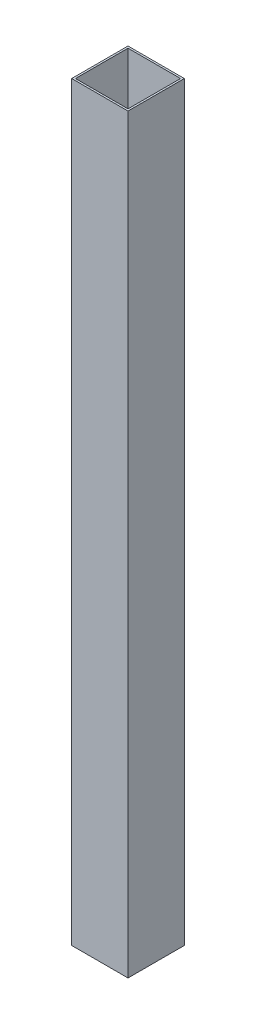
ISO-10303-21;
HEADER;
FILE_DESCRIPTION(('STEP AP214'),'2;1');
FILE_NAME('part.step','',(''),(''),'','','');
FILE_SCHEMA(('AUTOMOTIVE_DESIGN { 1 0 10303 214 1 1 1 1 }'));
ENDSEC;
DATA;
#1=APPLICATION_CONTEXT('core data for automotive mechanical design processes');
#2=APPLICATION_PROTOCOL_DEFINITION('international standard','automotive_design',2000,#1);
#3=PRODUCT_CONTEXT('',#1,'mechanical');
#4=PRODUCT('Part','Part','',(#3));
#5=PRODUCT_RELATED_PRODUCT_CATEGORY('part','',(#4));
#6=PRODUCT_DEFINITION_FORMATION('','',#4);
#7=PRODUCT_DEFINITION_CONTEXT('part definition',#1,'design');
#8=PRODUCT_DEFINITION('design','',#6,#7);
#9=PRODUCT_DEFINITION_SHAPE('','',#8);
#10=(LENGTH_UNIT() NAMED_UNIT(*) SI_UNIT(.MILLI.,.METRE.));
#11=(NAMED_UNIT(*) PLANE_ANGLE_UNIT() SI_UNIT($,.RADIAN.));
#12=(NAMED_UNIT(*) SI_UNIT($,.STERADIAN.) SOLID_ANGLE_UNIT());
#13=UNCERTAINTY_MEASURE_WITH_UNIT(LENGTH_MEASURE(1.E-05),#10,'distance_accuracy_value','');
#14=(GEOMETRIC_REPRESENTATION_CONTEXT(3) GLOBAL_UNCERTAINTY_ASSIGNED_CONTEXT((#13)) GLOBAL_UNIT_ASSIGNED_CONTEXT((#10,
#11,#12)) REPRESENTATION_CONTEXT('',''));
#15=CARTESIAN_POINT('',(0.,0.,0.));
#16=DIRECTION('',(0.,0.,1.));
#17=DIRECTION('',(1.,0.,0.));
#18=AXIS2_PLACEMENT_3D('',#15,#16,#17);
#19=CARTESIAN_POINT('',(38.1,0.,0.));
#20=DIRECTION('',(1.,0.,0.));
#21=DIRECTION('',(0.,0.,-1.));
#22=AXIS2_PLACEMENT_3D('',#19,#20,#21);
#23=PLANE('',#22);
#24=DIRECTION('',(0.,1.,0.));
#25=VECTOR('',#24,1.);
#26=CARTESIAN_POINT('',(38.1,0.,0.));
#27=LINE('',#26,#25);
#28=CARTESIAN_POINT('',(38.1,0.,0.));
#29=VERTEX_POINT('',#28);
#30=CARTESIAN_POINT('',(38.1,508.,0.));
#31=VERTEX_POINT('',#30);
#32=EDGE_CURVE('E114',#29,#31,#27,.T.);
#33=ORIENTED_EDGE('',*,*,#32,.F.);
#34=DIRECTION('',(0.,0.,1.));
#35=VECTOR('',#34,1.);
#36=CARTESIAN_POINT('',(38.1,0.,0.));
#37=LINE('',#36,#35);
#38=CARTESIAN_POINT('',(38.1,0.,-38.1));
#39=VERTEX_POINT('',#38);
#40=EDGE_CURVE('E136',#29,#39,#37,.F.);
#41=ORIENTED_EDGE('',*,*,#40,.T.);
#42=DIRECTION('',(0.,1.,0.));
#43=VECTOR('',#42,1.);
#44=CARTESIAN_POINT('',(38.1,0.,-38.1));
#45=LINE('',#44,#43);
#46=CARTESIAN_POINT('',(38.1,508.,-38.1));
#47=VERTEX_POINT('',#46);
#48=EDGE_CURVE('E131',#47,#39,#45,.F.);
#49=ORIENTED_EDGE('',*,*,#48,.F.);
#50=DIRECTION('',(0.,0.,1.));
#51=VECTOR('',#50,1.);
#52=CARTESIAN_POINT('',(38.1,508.,0.));
#53=LINE('',#52,#51);
#54=EDGE_CURVE('E106',#31,#47,#53,.F.);
#55=ORIENTED_EDGE('',*,*,#54,.F.);
#56=EDGE_LOOP('',(#33,#41,#49,#55));
#57=FACE_BOUND('',#56,.T.);
#58=ADVANCED_FACE('F17',(#57),#23,.T.);
#59=CARTESIAN_POINT('',(1.27,0.,-36.83));
#60=DIRECTION('',(0.,0.,1.));
#61=DIRECTION('',(1.,0.,0.));
#62=AXIS2_PLACEMENT_3D('',#59,#60,#61);
#63=PLANE('',#62);
#64=DIRECTION('',(0.,1.,0.));
#65=VECTOR('',#64,1.);
#66=CARTESIAN_POINT('',(1.27,0.,-36.83));
#67=LINE('',#66,#65);
#68=CARTESIAN_POINT('',(1.27,0.,-36.83));
#69=VERTEX_POINT('',#68);
#70=CARTESIAN_POINT('',(1.27,508.,-36.83));
#71=VERTEX_POINT('',#70);
#72=EDGE_CURVE('E91',#69,#71,#67,.T.);
#73=ORIENTED_EDGE('',*,*,#72,.F.);
#74=DIRECTION('',(1.,0.,0.));
#75=VECTOR('',#74,1.);
#76=CARTESIAN_POINT('',(0.,0.,-36.83));
#77=LINE('',#76,#75);
#78=CARTESIAN_POINT('',(36.83,0.,-36.83));
#79=VERTEX_POINT('',#78);
#80=EDGE_CURVE('E139',#69,#79,#77,.T.);
#81=ORIENTED_EDGE('',*,*,#80,.T.);
#82=DIRECTION('',(0.,1.,0.));
#83=VECTOR('',#82,1.);
#84=CARTESIAN_POINT('',(36.83,0.,-36.83));
#85=LINE('',#84,#83);
#86=CARTESIAN_POINT('',(36.83,508.,-36.83));
#87=VERTEX_POINT('',#86);
#88=EDGE_CURVE('E20',#87,#79,#85,.F.);
#89=ORIENTED_EDGE('',*,*,#88,.F.);
#90=DIRECTION('',(1.,0.,0.));
#91=VECTOR('',#90,1.);
#92=CARTESIAN_POINT('',(0.,508.,-36.83));
#93=LINE('',#92,#91);
#94=EDGE_CURVE('E105',#71,#87,#93,.T.);
#95=ORIENTED_EDGE('',*,*,#94,.F.);
#96=EDGE_LOOP('',(#73,#81,#89,#95));
#97=FACE_BOUND('',#96,.T.);
#98=ADVANCED_FACE('F125',(#97),#63,.T.);
#99=CARTESIAN_POINT('',(36.83,0.,-36.83));
#100=DIRECTION('',(-1.,0.,0.));
#101=DIRECTION('',(0.,0.,1.));
#102=AXIS2_PLACEMENT_3D('',#99,#100,#101);
#103=PLANE('',#102);
#104=ORIENTED_EDGE('',*,*,#88,.T.);
#105=DIRECTION('',(0.,0.,1.));
#106=VECTOR('',#105,1.);
#107=CARTESIAN_POINT('',(36.83,0.,0.));
#108=LINE('',#107,#106);
#109=CARTESIAN_POINT('',(36.83,0.,-1.27));
#110=VERTEX_POINT('',#109);
#111=EDGE_CURVE('E88',#79,#110,#108,.T.);
#112=ORIENTED_EDGE('',*,*,#111,.T.);
#113=DIRECTION('',(0.,1.,0.));
#114=VECTOR('',#113,1.);
#115=CARTESIAN_POINT('',(36.83,0.,-1.27));
#116=LINE('',#115,#114);
#117=CARTESIAN_POINT('',(36.83,508.,-1.27));
#118=VERTEX_POINT('',#117);
#119=EDGE_CURVE('E80',#118,#110,#116,.F.);
#120=ORIENTED_EDGE('',*,*,#119,.F.);
#121=DIRECTION('',(0.,0.,1.));
#122=VECTOR('',#121,1.);
#123=CARTESIAN_POINT('',(36.83,508.,0.));
#124=LINE('',#123,#122);
#125=EDGE_CURVE('E85',#87,#118,#124,.T.);
#126=ORIENTED_EDGE('',*,*,#125,.F.);
#127=EDGE_LOOP('',(#104,#112,#120,#126));
#128=FACE_BOUND('',#127,.T.);
#129=ADVANCED_FACE('F83',(#128),#103,.T.);
#130=CARTESIAN_POINT('',(36.83,0.,-1.27));
#131=DIRECTION('',(0.,0.,-1.));
#132=DIRECTION('',(-1.,0.,0.));
#133=AXIS2_PLACEMENT_3D('',#130,#131,#132);
#134=PLANE('',#133);
#135=ORIENTED_EDGE('',*,*,#119,.T.);
#136=DIRECTION('',(1.,0.,0.));
#137=VECTOR('',#136,1.);
#138=CARTESIAN_POINT('',(0.,0.,-1.27));
#139=LINE('',#138,#137);
#140=CARTESIAN_POINT('',(1.27,0.,-1.27));
#141=VERTEX_POINT('',#140);
#142=EDGE_CURVE('E142',#110,#141,#139,.F.);
#143=ORIENTED_EDGE('',*,*,#142,.T.);
#144=DIRECTION('',(0.,1.,0.));
#145=VECTOR('',#144,1.);
#146=CARTESIAN_POINT('',(1.27,0.,-1.27));
#147=LINE('',#146,#145);
#148=CARTESIAN_POINT('',(1.27,508.,-1.27));
#149=VERTEX_POINT('',#148);
#150=EDGE_CURVE('E96',#149,#141,#147,.F.);
#151=ORIENTED_EDGE('',*,*,#150,.F.);
#152=DIRECTION('',(1.,0.,0.));
#153=VECTOR('',#152,1.);
#154=CARTESIAN_POINT('',(0.,508.,-1.27));
#155=LINE('',#154,#153);
#156=EDGE_CURVE('E93',#118,#149,#155,.F.);
#157=ORIENTED_EDGE('',*,*,#156,.F.);
#158=EDGE_LOOP('',(#135,#143,#151,#157));
#159=FACE_BOUND('',#158,.T.);
#160=ADVANCED_FACE('F94',(#159),#134,.T.);
#161=CARTESIAN_POINT('',(1.27,0.,-1.27));
#162=DIRECTION('',(1.,0.,0.));
#163=DIRECTION('',(0.,0.,-1.));
#164=AXIS2_PLACEMENT_3D('',#161,#162,#163);
#165=PLANE('',#164);
#166=ORIENTED_EDGE('',*,*,#150,.T.);
#167=DIRECTION('',(0.,0.,1.));
#168=VECTOR('',#167,1.);
#169=CARTESIAN_POINT('',(1.27,0.,0.));
#170=LINE('',#169,#168);
#171=EDGE_CURVE('E122',#141,#69,#170,.F.);
#172=ORIENTED_EDGE('',*,*,#171,.T.);
#173=ORIENTED_EDGE('',*,*,#72,.T.);
#174=DIRECTION('',(0.,0.,1.));
#175=VECTOR('',#174,1.);
#176=CARTESIAN_POINT('',(1.27,508.,0.));
#177=LINE('',#176,#175);
#178=EDGE_CURVE('E100',#149,#71,#177,.F.);
#179=ORIENTED_EDGE('',*,*,#178,.F.);
#180=EDGE_LOOP('',(#166,#172,#173,#179));
#181=FACE_BOUND('',#180,.T.);
#182=ADVANCED_FACE('F120',(#181),#165,.T.);
#183=CARTESIAN_POINT('',(0.,0.,0.));
#184=DIRECTION('',(0.,0.,1.));
#185=DIRECTION('',(1.,0.,0.));
#186=AXIS2_PLACEMENT_3D('',#183,#184,#185);
#187=PLANE('',#186);
#188=DIRECTION('',(0.,1.,0.));
#189=VECTOR('',#188,1.);
#190=CARTESIAN_POINT('',(0.,0.,0.));
#191=LINE('',#190,#189);
#192=CARTESIAN_POINT('',(0.,0.,0.));
#193=VERTEX_POINT('',#192);
#194=CARTESIAN_POINT('',(0.,508.,0.));
#195=VERTEX_POINT('',#194);
#196=EDGE_CURVE('E145',#193,#195,#191,.T.);
#197=ORIENTED_EDGE('',*,*,#196,.F.);
#198=DIRECTION('',(1.,0.,0.));
#199=VECTOR('',#198,1.);
#200=CARTESIAN_POINT('',(0.,0.,0.));
#201=LINE('',#200,#199);
#202=EDGE_CURVE('E133',#193,#29,#201,.T.);
#203=ORIENTED_EDGE('',*,*,#202,.T.);
#204=ORIENTED_EDGE('',*,*,#32,.T.);
#205=DIRECTION('',(1.,0.,0.));
#206=VECTOR('',#205,1.);
#207=CARTESIAN_POINT('',(0.,508.,0.));
#208=LINE('',#207,#206);
#209=EDGE_CURVE('E108',#195,#31,#208,.T.);
#210=ORIENTED_EDGE('',*,*,#209,.F.);
#211=EDGE_LOOP('',(#197,#203,#204,#210));
#212=FACE_BOUND('',#211,.T.);
#213=ADVANCED_FACE('F164',(#212),#187,.T.);
#214=CARTESIAN_POINT('',(0.,508.,0.));
#215=DIRECTION('',(0.,1.,0.));
#216=DIRECTION('',(0.,0.,1.));
#217=AXIS2_PLACEMENT_3D('',#214,#215,#216);
#218=PLANE('',#217);
#219=ORIENTED_EDGE('',*,*,#178,.T.);
#220=ORIENTED_EDGE('',*,*,#94,.T.);
#221=ORIENTED_EDGE('',*,*,#125,.T.);
#222=ORIENTED_EDGE('',*,*,#156,.T.);
#223=EDGE_LOOP('',(#219,#220,#221,#222));
#224=FACE_BOUND('',#223,.T.);
#225=DIRECTION('',(-1.,0.,0.));
#226=VECTOR('',#225,1.);
#227=CARTESIAN_POINT('',(38.1,508.,-38.1));
#228=LINE('',#227,#226);
#229=CARTESIAN_POINT('',(0.,508.,-38.1));
#230=VERTEX_POINT('',#229);
#231=EDGE_CURVE('E126',#230,#47,#228,.F.);
#232=ORIENTED_EDGE('',*,*,#231,.F.);
#233=DIRECTION('',(0.,0.,1.));
#234=VECTOR('',#233,1.);
#235=CARTESIAN_POINT('',(0.,508.,-38.1));
#236=LINE('',#235,#234);
#237=EDGE_CURVE('E148',#195,#230,#236,.F.);
#238=ORIENTED_EDGE('',*,*,#237,.F.);
#239=ORIENTED_EDGE('',*,*,#209,.T.);
#240=ORIENTED_EDGE('',*,*,#54,.T.);
#241=EDGE_LOOP('',(#232,#238,#239,#240));
#242=FACE_BOUND('',#241,.T.);
#243=ADVANCED_FACE('F102',(#224,#242),#218,.T.);
#244=CARTESIAN_POINT('',(38.1,0.,-38.1));
#245=DIRECTION('',(0.,0.,-1.));
#246=DIRECTION('',(-1.,0.,0.));
#247=AXIS2_PLACEMENT_3D('',#244,#245,#246);
#248=PLANE('',#247);
#249=ORIENTED_EDGE('',*,*,#48,.T.);
#250=DIRECTION('',(1.,0.,0.));
#251=VECTOR('',#250,1.);
#252=CARTESIAN_POINT('',(0.,0.,-38.1));
#253=LINE('',#252,#251);
#254=CARTESIAN_POINT('',(0.,0.,-38.1));
#255=VERTEX_POINT('',#254);
#256=EDGE_CURVE('E35',#39,#255,#253,.F.);
#257=ORIENTED_EDGE('',*,*,#256,.T.);
#258=DIRECTION('',(0.,1.,0.));
#259=VECTOR('',#258,1.);
#260=CARTESIAN_POINT('',(0.,0.,-38.1));
#261=LINE('',#260,#259);
#262=EDGE_CURVE('E26',#230,#255,#261,.F.);
#263=ORIENTED_EDGE('',*,*,#262,.F.);
#264=ORIENTED_EDGE('',*,*,#231,.T.);
#265=EDGE_LOOP('',(#249,#257,#263,#264));
#266=FACE_BOUND('',#265,.T.);
#267=ADVANCED_FACE('F155',(#266),#248,.T.);
#268=CARTESIAN_POINT('',(0.,0.,0.));
#269=DIRECTION('',(0.,1.,0.));
#270=DIRECTION('',(0.,0.,1.));
#271=AXIS2_PLACEMENT_3D('',#268,#269,#270);
#272=PLANE('',#271);
#273=ORIENTED_EDGE('',*,*,#142,.F.);
#274=ORIENTED_EDGE('',*,*,#111,.F.);
#275=ORIENTED_EDGE('',*,*,#80,.F.);
#276=ORIENTED_EDGE('',*,*,#171,.F.);
#277=EDGE_LOOP('',(#273,#274,#275,#276));
#278=FACE_BOUND('',#277,.T.);
#279=ORIENTED_EDGE('',*,*,#40,.F.);
#280=ORIENTED_EDGE('',*,*,#202,.F.);
#281=DIRECTION('',(0.,0.,1.));
#282=VECTOR('',#281,1.);
#283=CARTESIAN_POINT('',(0.,0.,-38.1));
#284=LINE('',#283,#282);
#285=EDGE_CURVE('E11',#255,#193,#284,.T.);
#286=ORIENTED_EDGE('',*,*,#285,.F.);
#287=ORIENTED_EDGE('',*,*,#256,.F.);
#288=EDGE_LOOP('',(#279,#280,#286,#287));
#289=FACE_BOUND('',#288,.T.);
#290=ADVANCED_FACE('F162',(#278,#289),#272,.F.);
#291=CARTESIAN_POINT('',(0.,0.,-38.1));
#292=DIRECTION('',(-1.,0.,0.));
#293=DIRECTION('',(0.,0.,1.));
#294=AXIS2_PLACEMENT_3D('',#291,#292,#293);
#295=PLANE('',#294);
#296=ORIENTED_EDGE('',*,*,#262,.T.);
#297=ORIENTED_EDGE('',*,*,#285,.T.);
#298=ORIENTED_EDGE('',*,*,#196,.T.);
#299=ORIENTED_EDGE('',*,*,#237,.T.);
#300=EDGE_LOOP('',(#296,#297,#298,#299));
#301=FACE_BOUND('',#300,.T.);
#302=ADVANCED_FACE('F153',(#301),#295,.T.);
#303=CLOSED_SHELL('',(#58,#98,#129,#160,#182,#213,#243,#267,#290,#302));
#304=MANIFOLD_SOLID_BREP('B1',#303);
#305=ADVANCED_BREP_SHAPE_REPRESENTATION('',(#18,#304),#14);
#306=SHAPE_DEFINITION_REPRESENTATION(#9,#305);
ENDSEC;
END-ISO-10303-21;
